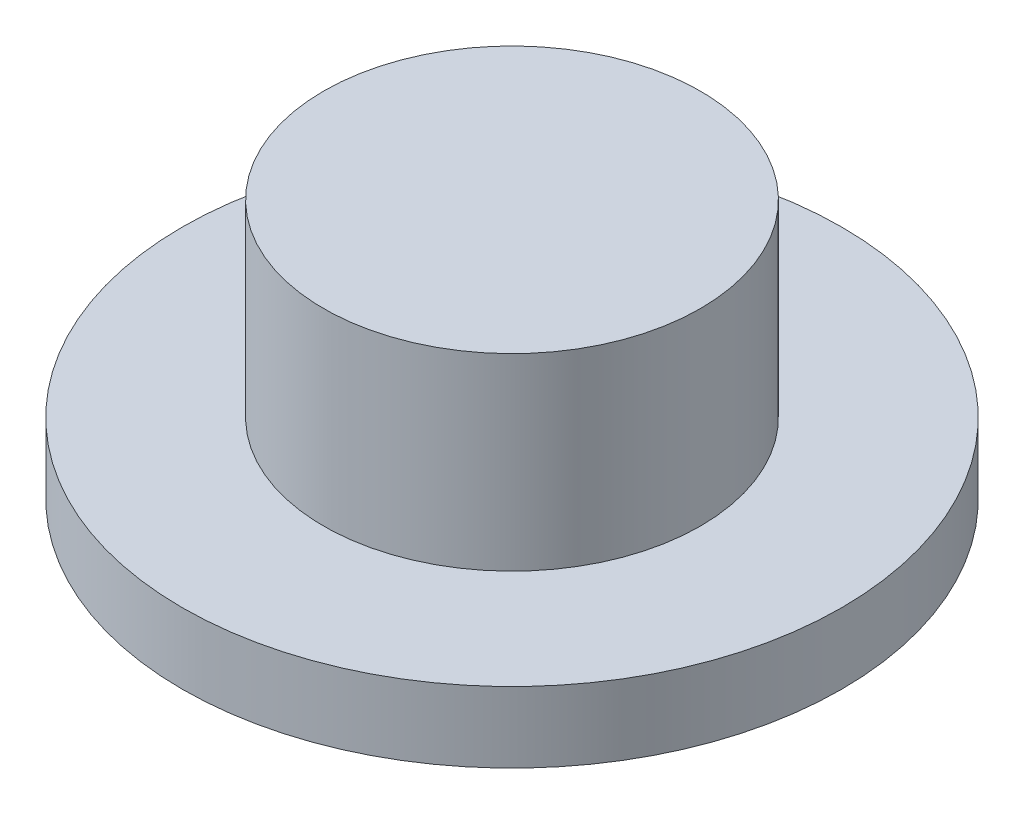
ISO-10303-21;
HEADER;
FILE_DESCRIPTION(('STEP AP214'),'2;1');
FILE_NAME('part.step','',(''),(''),'','','');
FILE_SCHEMA(('AUTOMOTIVE_DESIGN { 1 0 10303 214 1 1 1 1 }'));
ENDSEC;
DATA;
#1=APPLICATION_CONTEXT('core data for automotive mechanical design processes');
#2=APPLICATION_PROTOCOL_DEFINITION('international standard','automotive_design',2000,#1);
#3=PRODUCT_CONTEXT('',#1,'mechanical');
#4=PRODUCT('Part','Part','',(#3));
#5=PRODUCT_RELATED_PRODUCT_CATEGORY('part','',(#4));
#6=PRODUCT_DEFINITION_FORMATION('','',#4);
#7=PRODUCT_DEFINITION_CONTEXT('part definition',#1,'design');
#8=PRODUCT_DEFINITION('design','',#6,#7);
#9=PRODUCT_DEFINITION_SHAPE('','',#8);
#10=(LENGTH_UNIT() NAMED_UNIT(*) SI_UNIT(.MILLI.,.METRE.));
#11=(NAMED_UNIT(*) PLANE_ANGLE_UNIT() SI_UNIT($,.RADIAN.));
#12=(NAMED_UNIT(*) SI_UNIT($,.STERADIAN.) SOLID_ANGLE_UNIT());
#13=UNCERTAINTY_MEASURE_WITH_UNIT(LENGTH_MEASURE(1.E-05),#10,'distance_accuracy_value','');
#14=(GEOMETRIC_REPRESENTATION_CONTEXT(3) GLOBAL_UNCERTAINTY_ASSIGNED_CONTEXT((#13)) GLOBAL_UNIT_ASSIGNED_CONTEXT((#10,
#11,#12)) REPRESENTATION_CONTEXT('',''));
#15=CARTESIAN_POINT('',(0.,0.,0.));
#16=DIRECTION('',(0.,0.,1.));
#17=DIRECTION('',(1.,0.,0.));
#18=AXIS2_PLACEMENT_3D('',#15,#16,#17);
#19=CARTESIAN_POINT('',(0.,1.,0.));
#20=DIRECTION('',(0.,-1.,0.));
#21=DIRECTION('',(1.,0.,0.));
#22=AXIS2_PLACEMENT_3D('',#19,#20,#21);
#23=CONICAL_SURFACE('',#22,1.75,0.244978663126864);
#24=CARTESIAN_POINT('',(0.,0.,0.));
#25=DIRECTION('',(0.,-1.,0.));
#26=DIRECTION('',(1.,0.,0.));
#27=AXIS2_PLACEMENT_3D('',#24,#25,#26);
#28=CIRCLE('',#27,2.);
#29=CARTESIAN_POINT('',(2.,0.,0.));
#30=VERTEX_POINT('',#29);
#31=EDGE_CURVE('E10',#30,#30,#28,.T.);
#32=ORIENTED_EDGE('',*,*,#31,.T.);
#33=EDGE_LOOP('',(#32));
#34=FACE_BOUND('',#33,.T.);
#35=CARTESIAN_POINT('',(0.,1.,0.));
#36=DIRECTION('',(0.,-1.,0.));
#37=DIRECTION('',(1.,0.,0.));
#38=AXIS2_PLACEMENT_3D('',#35,#36,#37);
#39=CIRCLE('',#38,1.75);
#40=CARTESIAN_POINT('',(1.75,1.,0.));
#41=VERTEX_POINT('',#40);
#42=EDGE_CURVE('E53',#41,#41,#39,.T.);
#43=ORIENTED_EDGE('',*,*,#42,.F.);
#44=EDGE_LOOP('',(#43));
#45=FACE_BOUND('',#44,.T.);
#46=ADVANCED_FACE('F31',(#34,#45),#23,.F.);
#47=CARTESIAN_POINT('',(2.,0.,0.));
#48=DIRECTION('',(0.,-1.,0.));
#49=DIRECTION('',(1.,0.,0.));
#50=AXIS2_PLACEMENT_3D('',#47,#48,#49);
#51=PLANE('',#50);
#52=CARTESIAN_POINT('',(0.,0.,0.));
#53=DIRECTION('',(0.,-1.,0.));
#54=DIRECTION('',(1.,0.,0.));
#55=AXIS2_PLACEMENT_3D('',#52,#53,#54);
#56=CIRCLE('',#55,7.);
#57=CARTESIAN_POINT('',(7.,0.,0.));
#58=VERTEX_POINT('',#57);
#59=EDGE_CURVE('E37',#58,#58,#56,.T.);
#60=ORIENTED_EDGE('',*,*,#59,.T.);
#61=EDGE_LOOP('',(#60));
#62=FACE_BOUND('',#61,.T.);
#63=ORIENTED_EDGE('',*,*,#31,.F.);
#64=EDGE_LOOP('',(#63));
#65=FACE_BOUND('',#64,.T.);
#66=ADVANCED_FACE('F60',(#62,#65),#51,.T.);
#67=CARTESIAN_POINT('',(0.,5.5,0.));
#68=DIRECTION('',(0.,-1.,0.));
#69=DIRECTION('',(1.,0.,0.));
#70=AXIS2_PLACEMENT_3D('',#67,#68,#69);
#71=CYLINDRICAL_SURFACE('',#70,7.);
#72=CARTESIAN_POINT('',(0.,1.5,0.));
#73=DIRECTION('',(0.,-1.,0.));
#74=DIRECTION('',(1.,0.,0.));
#75=AXIS2_PLACEMENT_3D('',#72,#73,#74);
#76=CIRCLE('',#75,7.);
#77=CARTESIAN_POINT('',(7.,1.5,0.));
#78=VERTEX_POINT('',#77);
#79=EDGE_CURVE('E41',#78,#78,#76,.T.);
#80=ORIENTED_EDGE('',*,*,#79,.T.);
#81=EDGE_LOOP('',(#80));
#82=FACE_BOUND('',#81,.T.);
#83=ORIENTED_EDGE('',*,*,#59,.F.);
#84=EDGE_LOOP('',(#83));
#85=FACE_BOUND('',#84,.T.);
#86=ADVANCED_FACE('F64',(#82,#85),#71,.T.);
#87=CARTESIAN_POINT('',(4.,1.5,0.));
#88=DIRECTION('',(0.,1.,0.));
#89=DIRECTION('',(-1.,0.,0.));
#90=AXIS2_PLACEMENT_3D('',#87,#88,#89);
#91=PLANE('',#90);
#92=CARTESIAN_POINT('',(0.,1.5,0.));
#93=DIRECTION('',(0.,-1.,0.));
#94=DIRECTION('',(1.,0.,0.));
#95=AXIS2_PLACEMENT_3D('',#92,#93,#94);
#96=CIRCLE('',#95,4.);
#97=CARTESIAN_POINT('',(4.,1.5,0.));
#98=VERTEX_POINT('',#97);
#99=EDGE_CURVE('E45',#98,#98,#96,.T.);
#100=ORIENTED_EDGE('',*,*,#99,.T.);
#101=EDGE_LOOP('',(#100));
#102=FACE_BOUND('',#101,.T.);
#103=ORIENTED_EDGE('',*,*,#79,.F.);
#104=EDGE_LOOP('',(#103));
#105=FACE_BOUND('',#104,.T.);
#106=ADVANCED_FACE('F68',(#102,#105),#91,.T.);
#107=CARTESIAN_POINT('',(0.,5.5,0.));
#108=DIRECTION('',(0.,-1.,0.));
#109=DIRECTION('',(1.,0.,0.));
#110=AXIS2_PLACEMENT_3D('',#107,#108,#109);
#111=CYLINDRICAL_SURFACE('',#110,4.);
#112=CARTESIAN_POINT('',(0.,5.5,0.));
#113=DIRECTION('',(0.,-1.,0.));
#114=DIRECTION('',(1.,0.,0.));
#115=AXIS2_PLACEMENT_3D('',#112,#113,#114);
#116=CIRCLE('',#115,4.);
#117=CARTESIAN_POINT('',(4.,5.5,0.));
#118=VERTEX_POINT('',#117);
#119=EDGE_CURVE('E50',#118,#118,#116,.T.);
#120=ORIENTED_EDGE('',*,*,#119,.T.);
#121=EDGE_LOOP('',(#120));
#122=FACE_BOUND('',#121,.T.);
#123=ORIENTED_EDGE('',*,*,#99,.F.);
#124=EDGE_LOOP('',(#123));
#125=FACE_BOUND('',#124,.T.);
#126=ADVANCED_FACE('F75',(#122,#125),#111,.T.);
#127=CARTESIAN_POINT('',(0.,5.5,0.));
#128=DIRECTION('',(0.,1.,0.));
#129=DIRECTION('',(-1.,0.,0.));
#130=AXIS2_PLACEMENT_3D('',#127,#128,#129);
#131=PLANE('',#130);
#132=ORIENTED_EDGE('',*,*,#119,.F.);
#133=EDGE_LOOP('',(#132));
#134=FACE_BOUND('',#133,.T.);
#135=ADVANCED_FACE('F79',(#134),#131,.T.);
#136=CARTESIAN_POINT('',(0.,1.,0.));
#137=DIRECTION('',(0.,-1.,0.));
#138=DIRECTION('',(1.,0.,0.));
#139=AXIS2_PLACEMENT_3D('',#136,#137,#138);
#140=PLANE('',#139);
#141=ORIENTED_EDGE('',*,*,#42,.T.);
#142=EDGE_LOOP('',(#141));
#143=FACE_BOUND('',#142,.T.);
#144=ADVANCED_FACE('F57',(#143),#140,.T.);
#145=CLOSED_SHELL('',(#46,#66,#86,#106,#126,#135,#144));
#146=MANIFOLD_SOLID_BREP('B2',#145);
#147=ADVANCED_BREP_SHAPE_REPRESENTATION('',(#18,#146),#14);
#148=SHAPE_DEFINITION_REPRESENTATION(#9,#147);
ENDSEC;
END-ISO-10303-21;
